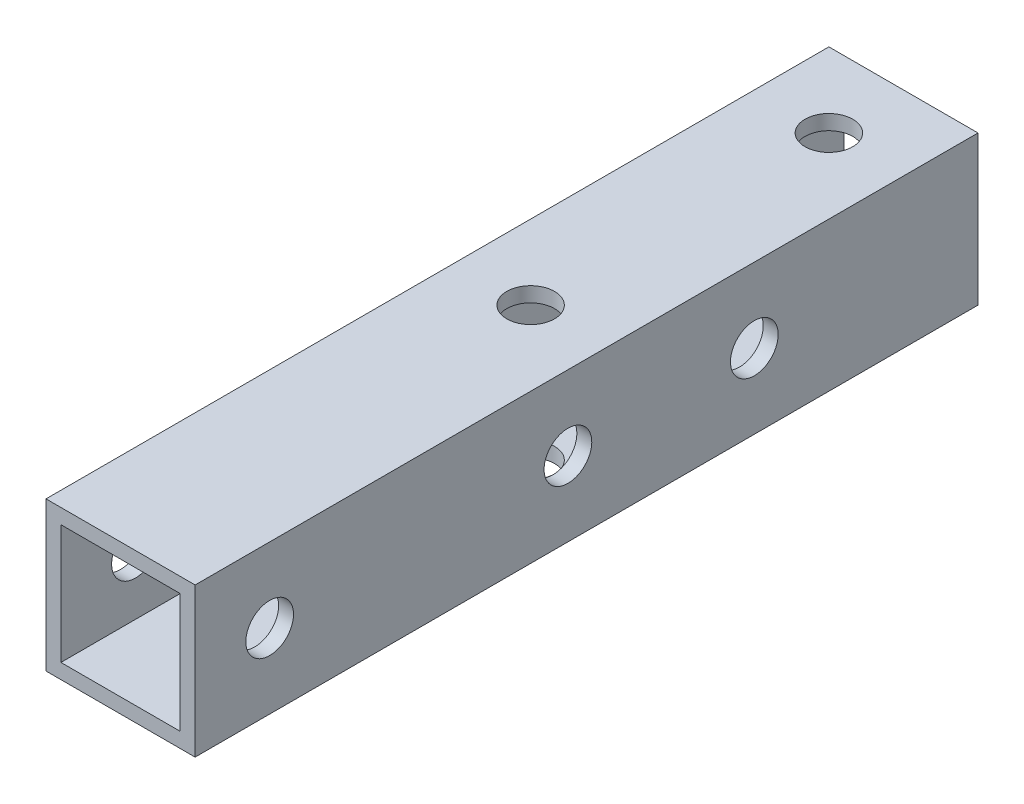
ISO-10303-21;
HEADER;
FILE_DESCRIPTION(('STEP AP214'),'2;1');
FILE_NAME('part.step','',(''),(''),'','','');
FILE_SCHEMA(('AUTOMOTIVE_DESIGN { 1 0 10303 214 1 1 1 1 }'));
ENDSEC;
DATA;
#1=APPLICATION_CONTEXT('core data for automotive mechanical design processes');
#2=APPLICATION_PROTOCOL_DEFINITION('international standard','automotive_design',2000,#1);
#3=PRODUCT_CONTEXT('',#1,'mechanical');
#4=PRODUCT('Part','Part','',(#3));
#5=PRODUCT_RELATED_PRODUCT_CATEGORY('part','',(#4));
#6=PRODUCT_DEFINITION_FORMATION('','',#4);
#7=PRODUCT_DEFINITION_CONTEXT('part definition',#1,'design');
#8=PRODUCT_DEFINITION('design','',#6,#7);
#9=PRODUCT_DEFINITION_SHAPE('','',#8);
#10=(LENGTH_UNIT() NAMED_UNIT(*) SI_UNIT(.MILLI.,.METRE.));
#11=(NAMED_UNIT(*) PLANE_ANGLE_UNIT() SI_UNIT($,.RADIAN.));
#12=(NAMED_UNIT(*) SI_UNIT($,.STERADIAN.) SOLID_ANGLE_UNIT());
#13=UNCERTAINTY_MEASURE_WITH_UNIT(LENGTH_MEASURE(1.E-05),#10,'distance_accuracy_value','');
#14=(GEOMETRIC_REPRESENTATION_CONTEXT(3) GLOBAL_UNCERTAINTY_ASSIGNED_CONTEXT((#13)) GLOBAL_UNIT_ASSIGNED_CONTEXT((#10,
#11,#12)) REPRESENTATION_CONTEXT('',''));
#15=CARTESIAN_POINT('',(0.,0.,0.));
#16=DIRECTION('',(0.,0.,1.));
#17=DIRECTION('',(1.,0.,0.));
#18=AXIS2_PLACEMENT_3D('',#15,#16,#17);
#19=CARTESIAN_POINT('',(0.,0.,52.5));
#20=DIRECTION('',(0.,0.,1.));
#21=DIRECTION('',(1.,0.,0.));
#22=AXIS2_PLACEMENT_3D('',#19,#20,#21);
#23=PLANE('',#22);
#24=DIRECTION('',(0.,-1.,0.));
#25=VECTOR('',#24,1.);
#26=CARTESIAN_POINT('',(-5.,5.,52.5));
#27=LINE('',#26,#25);
#28=CARTESIAN_POINT('',(-5.,5.,52.5));
#29=VERTEX_POINT('',#28);
#30=CARTESIAN_POINT('',(-5.,-5.,52.5));
#31=VERTEX_POINT('',#30);
#32=EDGE_CURVE('E181',#29,#31,#27,.T.);
#33=ORIENTED_EDGE('',*,*,#32,.T.);
#34=DIRECTION('',(1.,0.,0.));
#35=VECTOR('',#34,1.);
#36=CARTESIAN_POINT('',(5.,-5.,52.5));
#37=LINE('',#36,#35);
#38=CARTESIAN_POINT('',(5.,-5.,52.5));
#39=VERTEX_POINT('',#38);
#40=EDGE_CURVE('E185',#31,#39,#37,.T.);
#41=ORIENTED_EDGE('',*,*,#40,.T.);
#42=DIRECTION('',(0.,1.,0.));
#43=VECTOR('',#42,1.);
#44=CARTESIAN_POINT('',(5.,5.,52.5));
#45=LINE('',#44,#43);
#46=CARTESIAN_POINT('',(5.,5.,52.5));
#47=VERTEX_POINT('',#46);
#48=EDGE_CURVE('E189',#39,#47,#45,.T.);
#49=ORIENTED_EDGE('',*,*,#48,.T.);
#50=DIRECTION('',(-1.,0.,0.));
#51=VECTOR('',#50,1.);
#52=CARTESIAN_POINT('',(5.,5.,52.5));
#53=LINE('',#52,#51);
#54=EDGE_CURVE('E192',#47,#29,#53,.T.);
#55=ORIENTED_EDGE('',*,*,#54,.T.);
#56=EDGE_LOOP('',(#33,#41,#49,#55));
#57=FACE_BOUND('',#56,.T.);
#58=DIRECTION('',(1.,0.,0.));
#59=VECTOR('',#58,1.);
#60=CARTESIAN_POINT('',(0.,-4.,52.5));
#61=LINE('',#60,#59);
#62=CARTESIAN_POINT('',(-4.,-4.,52.5));
#63=VERTEX_POINT('',#62);
#64=CARTESIAN_POINT('',(4.,-4.,52.5));
#65=VERTEX_POINT('',#64);
#66=EDGE_CURVE('E140',#63,#65,#61,.T.);
#67=ORIENTED_EDGE('',*,*,#66,.F.);
#68=DIRECTION('',(0.,-1.,0.));
#69=VECTOR('',#68,1.);
#70=CARTESIAN_POINT('',(-4.,0.,52.5));
#71=LINE('',#70,#69);
#72=CARTESIAN_POINT('',(-4.,4.,52.5));
#73=VERTEX_POINT('',#72);
#74=EDGE_CURVE('E131',#73,#63,#71,.T.);
#75=ORIENTED_EDGE('',*,*,#74,.F.);
#76=DIRECTION('',(-1.,0.,0.));
#77=VECTOR('',#76,1.);
#78=CARTESIAN_POINT('',(0.,4.,52.5));
#79=LINE('',#78,#77);
#80=CARTESIAN_POINT('',(4.,4.,52.5));
#81=VERTEX_POINT('',#80);
#82=EDGE_CURVE('E157',#81,#73,#79,.T.);
#83=ORIENTED_EDGE('',*,*,#82,.F.);
#84=DIRECTION('',(0.,1.,0.));
#85=VECTOR('',#84,1.);
#86=CARTESIAN_POINT('',(4.,0.,52.5));
#87=LINE('',#86,#85);
#88=EDGE_CURVE('E153',#65,#81,#87,.T.);
#89=ORIENTED_EDGE('',*,*,#88,.F.);
#90=EDGE_LOOP('',(#67,#75,#83,#89));
#91=FACE_BOUND('',#90,.T.);
#92=ADVANCED_FACE('F63',(#57,#91),#23,.T.);
#93=CARTESIAN_POINT('',(0.,0.,0.));
#94=DIRECTION('',(0.,0.,1.));
#95=DIRECTION('',(1.,0.,0.));
#96=AXIS2_PLACEMENT_3D('',#93,#94,#95);
#97=PLANE('',#96);
#98=DIRECTION('',(0.,-1.,0.));
#99=VECTOR('',#98,1.);
#100=CARTESIAN_POINT('',(-5.,5.,0.));
#101=LINE('',#100,#99);
#102=CARTESIAN_POINT('',(-5.,5.,0.));
#103=VERTEX_POINT('',#102);
#104=CARTESIAN_POINT('',(-5.,-5.,0.));
#105=VERTEX_POINT('',#104);
#106=EDGE_CURVE('E149',#103,#105,#101,.T.);
#107=ORIENTED_EDGE('',*,*,#106,.F.);
#108=DIRECTION('',(-1.,0.,0.));
#109=VECTOR('',#108,1.);
#110=CARTESIAN_POINT('',(5.,5.,0.));
#111=LINE('',#110,#109);
#112=CARTESIAN_POINT('',(5.,5.,0.));
#113=VERTEX_POINT('',#112);
#114=EDGE_CURVE('E186',#113,#103,#111,.T.);
#115=ORIENTED_EDGE('',*,*,#114,.F.);
#116=DIRECTION('',(0.,1.,0.));
#117=VECTOR('',#116,1.);
#118=CARTESIAN_POINT('',(5.,5.,0.));
#119=LINE('',#118,#117);
#120=CARTESIAN_POINT('',(5.,-5.,0.));
#121=VERTEX_POINT('',#120);
#122=EDGE_CURVE('E202',#121,#113,#119,.T.);
#123=ORIENTED_EDGE('',*,*,#122,.F.);
#124=DIRECTION('',(1.,0.,0.));
#125=VECTOR('',#124,1.);
#126=CARTESIAN_POINT('',(5.,-5.,0.));
#127=LINE('',#126,#125);
#128=EDGE_CURVE('E199',#105,#121,#127,.T.);
#129=ORIENTED_EDGE('',*,*,#128,.F.);
#130=EDGE_LOOP('',(#107,#115,#123,#129));
#131=FACE_BOUND('',#130,.T.);
#132=DIRECTION('',(0.,-1.,0.));
#133=VECTOR('',#132,1.);
#134=CARTESIAN_POINT('',(-4.,0.,0.));
#135=LINE('',#134,#133);
#136=CARTESIAN_POINT('',(-4.,4.,0.));
#137=VERTEX_POINT('',#136);
#138=CARTESIAN_POINT('',(-4.,-4.,0.));
#139=VERTEX_POINT('',#138);
#140=EDGE_CURVE('E89',#137,#139,#135,.T.);
#141=ORIENTED_EDGE('',*,*,#140,.T.);
#142=DIRECTION('',(1.,0.,0.));
#143=VECTOR('',#142,1.);
#144=CARTESIAN_POINT('',(0.,-4.,0.));
#145=LINE('',#144,#143);
#146=CARTESIAN_POINT('',(4.,-4.,0.));
#147=VERTEX_POINT('',#146);
#148=EDGE_CURVE('E147',#139,#147,#145,.T.);
#149=ORIENTED_EDGE('',*,*,#148,.T.);
#150=DIRECTION('',(0.,1.,0.));
#151=VECTOR('',#150,1.);
#152=CARTESIAN_POINT('',(4.,0.,0.));
#153=LINE('',#152,#151);
#154=CARTESIAN_POINT('',(4.,4.,0.));
#155=VERTEX_POINT('',#154);
#156=EDGE_CURVE('E168',#147,#155,#153,.T.);
#157=ORIENTED_EDGE('',*,*,#156,.T.);
#158=DIRECTION('',(-1.,0.,0.));
#159=VECTOR('',#158,1.);
#160=CARTESIAN_POINT('',(0.,4.,0.));
#161=LINE('',#160,#159);
#162=EDGE_CURVE('E141',#155,#137,#161,.T.);
#163=ORIENTED_EDGE('',*,*,#162,.T.);
#164=EDGE_LOOP('',(#141,#149,#157,#163));
#165=FACE_BOUND('',#164,.T.);
#166=ADVANCED_FACE('F302',(#131,#165),#97,.F.);
#167=CARTESIAN_POINT('',(-5.,5.,52.5));
#168=DIRECTION('',(1.,0.,0.));
#169=DIRECTION('',(0.,1.,0.));
#170=AXIS2_PLACEMENT_3D('',#167,#168,#169);
#171=PLANE('',#170);
#172=CARTESIAN_POINT('',(-5.,0.,15.));
#173=DIRECTION('',(-1.,0.,0.));
#174=DIRECTION('',(0.,-1.,0.));
#175=AXIS2_PLACEMENT_3D('',#172,#173,#174);
#176=CIRCLE('',#175,1.6);
#177=CARTESIAN_POINT('',(-5.,-1.6,15.));
#178=VERTEX_POINT('',#177);
#179=EDGE_CURVE('E351',#178,#178,#176,.T.);
#180=ORIENTED_EDGE('',*,*,#179,.F.);
#181=EDGE_LOOP('',(#180));
#182=FACE_BOUND('',#181,.T.);
#183=CARTESIAN_POINT('',(-5.,0.,47.5));
#184=DIRECTION('',(1.,0.,0.));
#185=DIRECTION('',(0.,1.,0.));
#186=AXIS2_PLACEMENT_3D('',#183,#184,#185);
#187=CIRCLE('',#186,1.6);
#188=CARTESIAN_POINT('',(-5.,1.6,47.5));
#189=VERTEX_POINT('',#188);
#190=EDGE_CURVE('E231',#189,#189,#187,.T.);
#191=ORIENTED_EDGE('',*,*,#190,.T.);
#192=EDGE_LOOP('',(#191));
#193=FACE_BOUND('',#192,.T.);
#194=CARTESIAN_POINT('',(-5.,0.,27.5));
#195=DIRECTION('',(1.,0.,0.));
#196=DIRECTION('',(0.,1.,0.));
#197=AXIS2_PLACEMENT_3D('',#194,#195,#196);
#198=CIRCLE('',#197,1.6);
#199=CARTESIAN_POINT('',(-5.,1.6,27.5));
#200=VERTEX_POINT('',#199);
#201=EDGE_CURVE('E338',#200,#200,#198,.T.);
#202=ORIENTED_EDGE('',*,*,#201,.T.);
#203=EDGE_LOOP('',(#202));
#204=FACE_BOUND('',#203,.T.);
#205=ORIENTED_EDGE('',*,*,#106,.T.);
#206=DIRECTION('',(0.,0.,-1.));
#207=VECTOR('',#206,1.);
#208=CARTESIAN_POINT('',(-5.,-5.,52.5));
#209=LINE('',#208,#207);
#210=EDGE_CURVE('E12',#31,#105,#209,.T.);
#211=ORIENTED_EDGE('',*,*,#210,.F.);
#212=ORIENTED_EDGE('',*,*,#32,.F.);
#213=DIRECTION('',(0.,0.,-1.));
#214=VECTOR('',#213,1.);
#215=CARTESIAN_POINT('',(-5.,5.,52.5));
#216=LINE('',#215,#214);
#217=EDGE_CURVE('E195',#29,#103,#216,.T.);
#218=ORIENTED_EDGE('',*,*,#217,.T.);
#219=EDGE_LOOP('',(#205,#211,#212,#218));
#220=FACE_BOUND('',#219,.T.);
#221=ADVANCED_FACE('F65',(#182,#193,#204,#220),#171,.F.);
#222=CARTESIAN_POINT('',(5.,-5.,52.5));
#223=DIRECTION('',(0.,1.,0.));
#224=DIRECTION('',(-1.,0.,0.));
#225=AXIS2_PLACEMENT_3D('',#222,#223,#224);
#226=PLANE('',#225);
#227=CARTESIAN_POINT('',(0.,-5.,5.));
#228=DIRECTION('',(0.,1.,0.));
#229=DIRECTION('',(-1.,0.,0.));
#230=AXIS2_PLACEMENT_3D('',#227,#228,#229);
#231=CIRCLE('',#230,1.6);
#232=CARTESIAN_POINT('',(-1.6,-5.,5.));
#233=VERTEX_POINT('',#232);
#234=EDGE_CURVE('E222',#233,#233,#231,.T.);
#235=ORIENTED_EDGE('',*,*,#234,.T.);
#236=EDGE_LOOP('',(#235));
#237=FACE_BOUND('',#236,.T.);
#238=CARTESIAN_POINT('',(0.,-5.,25.));
#239=DIRECTION('',(0.,1.,0.));
#240=DIRECTION('',(-1.,0.,0.));
#241=AXIS2_PLACEMENT_3D('',#238,#239,#240);
#242=CIRCLE('',#241,1.6);
#243=CARTESIAN_POINT('',(-1.6,-5.,25.));
#244=VERTEX_POINT('',#243);
#245=EDGE_CURVE('E258',#244,#244,#242,.T.);
#246=ORIENTED_EDGE('',*,*,#245,.T.);
#247=EDGE_LOOP('',(#246));
#248=FACE_BOUND('',#247,.T.);
#249=ORIENTED_EDGE('',*,*,#128,.T.);
#250=DIRECTION('',(0.,0.,-1.));
#251=VECTOR('',#250,1.);
#252=CARTESIAN_POINT('',(5.,-5.,52.5));
#253=LINE('',#252,#251);
#254=EDGE_CURVE('E73',#39,#121,#253,.T.);
#255=ORIENTED_EDGE('',*,*,#254,.F.);
#256=ORIENTED_EDGE('',*,*,#40,.F.);
#257=ORIENTED_EDGE('',*,*,#210,.T.);
#258=EDGE_LOOP('',(#249,#255,#256,#257));
#259=FACE_BOUND('',#258,.T.);
#260=ADVANCED_FACE('F288',(#237,#248,#259),#226,.F.);
#261=CARTESIAN_POINT('',(5.,5.,52.5));
#262=DIRECTION('',(-1.,0.,0.));
#263=DIRECTION('',(0.,-1.,0.));
#264=AXIS2_PLACEMENT_3D('',#261,#262,#263);
#265=PLANE('',#264);
#266=CARTESIAN_POINT('',(5.,0.,15.));
#267=DIRECTION('',(-1.,0.,0.));
#268=DIRECTION('',(0.,-1.,0.));
#269=AXIS2_PLACEMENT_3D('',#266,#267,#268);
#270=CIRCLE('',#269,1.6);
#271=CARTESIAN_POINT('',(5.,-1.6,15.));
#272=VERTEX_POINT('',#271);
#273=EDGE_CURVE('E329',#272,#272,#270,.T.);
#274=ORIENTED_EDGE('',*,*,#273,.T.);
#275=EDGE_LOOP('',(#274));
#276=FACE_BOUND('',#275,.T.);
#277=CARTESIAN_POINT('',(5.,0.,47.5));
#278=DIRECTION('',(1.,0.,0.));
#279=DIRECTION('',(0.,1.,0.));
#280=AXIS2_PLACEMENT_3D('',#277,#278,#279);
#281=CIRCLE('',#280,1.6);
#282=CARTESIAN_POINT('',(5.,1.6,47.5));
#283=VERTEX_POINT('',#282);
#284=EDGE_CURVE('E333',#283,#283,#281,.T.);
#285=ORIENTED_EDGE('',*,*,#284,.F.);
#286=EDGE_LOOP('',(#285));
#287=FACE_BOUND('',#286,.T.);
#288=CARTESIAN_POINT('',(5.,0.,27.5));
#289=DIRECTION('',(1.,0.,0.));
#290=DIRECTION('',(0.,1.,0.));
#291=AXIS2_PLACEMENT_3D('',#288,#289,#290);
#292=CIRCLE('',#291,1.6);
#293=CARTESIAN_POINT('',(5.,1.6,27.5));
#294=VERTEX_POINT('',#293);
#295=EDGE_CURVE('E248',#294,#294,#292,.T.);
#296=ORIENTED_EDGE('',*,*,#295,.F.);
#297=EDGE_LOOP('',(#296));
#298=FACE_BOUND('',#297,.T.);
#299=ORIENTED_EDGE('',*,*,#122,.T.);
#300=DIRECTION('',(0.,0.,-1.));
#301=VECTOR('',#300,1.);
#302=CARTESIAN_POINT('',(5.,5.,52.5));
#303=LINE('',#302,#301);
#304=EDGE_CURVE('E210',#47,#113,#303,.T.);
#305=ORIENTED_EDGE('',*,*,#304,.F.);
#306=ORIENTED_EDGE('',*,*,#48,.F.);
#307=ORIENTED_EDGE('',*,*,#254,.T.);
#308=EDGE_LOOP('',(#299,#305,#306,#307));
#309=FACE_BOUND('',#308,.T.);
#310=ADVANCED_FACE('F291',(#276,#287,#298,#309),#265,.F.);
#311=CARTESIAN_POINT('',(5.,5.,52.5));
#312=DIRECTION('',(0.,-1.,0.));
#313=DIRECTION('',(1.,0.,0.));
#314=AXIS2_PLACEMENT_3D('',#311,#312,#313);
#315=PLANE('',#314);
#316=CARTESIAN_POINT('',(0.,5.,5.));
#317=DIRECTION('',(0.,1.,0.));
#318=DIRECTION('',(-1.,0.,0.));
#319=AXIS2_PLACEMENT_3D('',#316,#317,#318);
#320=CIRCLE('',#319,1.6);
#321=CARTESIAN_POINT('',(-1.6,5.,5.));
#322=VERTEX_POINT('',#321);
#323=EDGE_CURVE('E254',#322,#322,#320,.T.);
#324=ORIENTED_EDGE('',*,*,#323,.F.);
#325=EDGE_LOOP('',(#324));
#326=FACE_BOUND('',#325,.T.);
#327=CARTESIAN_POINT('',(0.,5.,25.));
#328=DIRECTION('',(0.,1.,0.));
#329=DIRECTION('',(-1.,0.,0.));
#330=AXIS2_PLACEMENT_3D('',#327,#328,#329);
#331=CIRCLE('',#330,1.6);
#332=CARTESIAN_POINT('',(-1.6,5.,25.));
#333=VERTEX_POINT('',#332);
#334=EDGE_CURVE('E241',#333,#333,#331,.T.);
#335=ORIENTED_EDGE('',*,*,#334,.F.);
#336=EDGE_LOOP('',(#335));
#337=FACE_BOUND('',#336,.T.);
#338=ORIENTED_EDGE('',*,*,#114,.T.);
#339=ORIENTED_EDGE('',*,*,#217,.F.);
#340=ORIENTED_EDGE('',*,*,#54,.F.);
#341=ORIENTED_EDGE('',*,*,#304,.T.);
#342=EDGE_LOOP('',(#338,#339,#340,#341));
#343=FACE_BOUND('',#342,.T.);
#344=ADVANCED_FACE('F306',(#326,#337,#343),#315,.F.);
#345=CARTESIAN_POINT('',(-4.,0.,52.5));
#346=DIRECTION('',(1.,0.,0.));
#347=DIRECTION('',(0.,1.,0.));
#348=AXIS2_PLACEMENT_3D('',#345,#346,#347);
#349=PLANE('',#348);
#350=CARTESIAN_POINT('',(-4.,0.,15.));
#351=DIRECTION('',(1.,0.,0.));
#352=DIRECTION('',(0.,1.,0.));
#353=AXIS2_PLACEMENT_3D('',#350,#351,#352);
#354=CIRCLE('',#353,1.6);
#355=CARTESIAN_POINT('',(-4.,1.6,15.));
#356=VERTEX_POINT('',#355);
#357=EDGE_CURVE('E339',#356,#356,#354,.T.);
#358=ORIENTED_EDGE('',*,*,#357,.F.);
#359=EDGE_LOOP('',(#358));
#360=FACE_BOUND('',#359,.T.);
#361=CARTESIAN_POINT('',(-4.,0.,47.5));
#362=DIRECTION('',(1.,0.,0.));
#363=DIRECTION('',(0.,1.,0.));
#364=AXIS2_PLACEMENT_3D('',#361,#362,#363);
#365=CIRCLE('',#364,1.6);
#366=CARTESIAN_POINT('',(-4.,1.6,47.5));
#367=VERTEX_POINT('',#366);
#368=EDGE_CURVE('E235',#367,#367,#365,.T.);
#369=ORIENTED_EDGE('',*,*,#368,.F.);
#370=EDGE_LOOP('',(#369));
#371=FACE_BOUND('',#370,.T.);
#372=CARTESIAN_POINT('',(-4.,0.,27.5));
#373=DIRECTION('',(1.,0.,0.));
#374=DIRECTION('',(0.,1.,0.));
#375=AXIS2_PLACEMENT_3D('',#372,#373,#374);
#376=CIRCLE('',#375,1.6);
#377=CARTESIAN_POINT('',(-4.,1.6,27.5));
#378=VERTEX_POINT('',#377);
#379=EDGE_CURVE('E230',#378,#378,#376,.T.);
#380=ORIENTED_EDGE('',*,*,#379,.F.);
#381=EDGE_LOOP('',(#380));
#382=FACE_BOUND('',#381,.T.);
#383=ORIENTED_EDGE('',*,*,#140,.F.);
#384=DIRECTION('',(0.,0.,-1.));
#385=VECTOR('',#384,1.);
#386=CARTESIAN_POINT('',(-4.,4.,52.5));
#387=LINE('',#386,#385);
#388=EDGE_CURVE('E135',#73,#137,#387,.T.);
#389=ORIENTED_EDGE('',*,*,#388,.F.);
#390=ORIENTED_EDGE('',*,*,#74,.T.);
#391=DIRECTION('',(0.,0.,-1.));
#392=VECTOR('',#391,1.);
#393=CARTESIAN_POINT('',(-4.,-4.,52.5));
#394=LINE('',#393,#392);
#395=EDGE_CURVE('E134',#63,#139,#394,.T.);
#396=ORIENTED_EDGE('',*,*,#395,.T.);
#397=EDGE_LOOP('',(#383,#389,#390,#396));
#398=FACE_BOUND('',#397,.T.);
#399=ADVANCED_FACE('F133',(#360,#371,#382,#398),#349,.T.);
#400=CARTESIAN_POINT('',(0.,-4.,52.5));
#401=DIRECTION('',(0.,1.,0.));
#402=DIRECTION('',(-1.,0.,0.));
#403=AXIS2_PLACEMENT_3D('',#400,#401,#402);
#404=PLANE('',#403);
#405=CARTESIAN_POINT('',(0.,-4.,5.));
#406=DIRECTION('',(0.,1.,0.));
#407=DIRECTION('',(-1.,0.,0.));
#408=AXIS2_PLACEMENT_3D('',#405,#406,#407);
#409=CIRCLE('',#408,1.6);
#410=CARTESIAN_POINT('',(-1.6,-4.,5.));
#411=VERTEX_POINT('',#410);
#412=EDGE_CURVE('E165',#411,#411,#409,.T.);
#413=ORIENTED_EDGE('',*,*,#412,.F.);
#414=EDGE_LOOP('',(#413));
#415=FACE_BOUND('',#414,.T.);
#416=CARTESIAN_POINT('',(0.,-4.,25.));
#417=DIRECTION('',(0.,1.,0.));
#418=DIRECTION('',(-1.,0.,0.));
#419=AXIS2_PLACEMENT_3D('',#416,#417,#418);
#420=CIRCLE('',#419,1.6);
#421=CARTESIAN_POINT('',(-1.6,-4.,25.));
#422=VERTEX_POINT('',#421);
#423=EDGE_CURVE('E221',#422,#422,#420,.T.);
#424=ORIENTED_EDGE('',*,*,#423,.F.);
#425=EDGE_LOOP('',(#424));
#426=FACE_BOUND('',#425,.T.);
#427=ORIENTED_EDGE('',*,*,#148,.F.);
#428=ORIENTED_EDGE('',*,*,#395,.F.);
#429=ORIENTED_EDGE('',*,*,#66,.T.);
#430=DIRECTION('',(0.,0.,-1.));
#431=VECTOR('',#430,1.);
#432=CARTESIAN_POINT('',(4.,-4.,52.5));
#433=LINE('',#432,#431);
#434=EDGE_CURVE('E150',#65,#147,#433,.T.);
#435=ORIENTED_EDGE('',*,*,#434,.T.);
#436=EDGE_LOOP('',(#427,#428,#429,#435));
#437=FACE_BOUND('',#436,.T.);
#438=ADVANCED_FACE('F144',(#415,#426,#437),#404,.T.);
#439=CARTESIAN_POINT('',(4.,0.,52.5));
#440=DIRECTION('',(-1.,0.,0.));
#441=DIRECTION('',(0.,-1.,0.));
#442=AXIS2_PLACEMENT_3D('',#439,#440,#441);
#443=PLANE('',#442);
#444=CARTESIAN_POINT('',(4.,0.,15.));
#445=DIRECTION('',(-1.,0.,0.));
#446=DIRECTION('',(0.,-1.,0.));
#447=AXIS2_PLACEMENT_3D('',#444,#445,#446);
#448=CIRCLE('',#447,1.6);
#449=CARTESIAN_POINT('',(4.,-1.6,15.));
#450=VERTEX_POINT('',#449);
#451=EDGE_CURVE('E67',#450,#450,#448,.T.);
#452=ORIENTED_EDGE('',*,*,#451,.F.);
#453=EDGE_LOOP('',(#452));
#454=FACE_BOUND('',#453,.T.);
#455=CARTESIAN_POINT('',(4.,0.,47.5));
#456=DIRECTION('',(-1.,0.,0.));
#457=DIRECTION('',(0.,-1.,0.));
#458=AXIS2_PLACEMENT_3D('',#455,#456,#457);
#459=CIRCLE('',#458,1.6);
#460=CARTESIAN_POINT('',(4.,-1.6,47.5));
#461=VERTEX_POINT('',#460);
#462=EDGE_CURVE('E232',#461,#461,#459,.T.);
#463=ORIENTED_EDGE('',*,*,#462,.F.);
#464=EDGE_LOOP('',(#463));
#465=FACE_BOUND('',#464,.T.);
#466=CARTESIAN_POINT('',(4.,0.,27.5));
#467=DIRECTION('',(-1.,0.,0.));
#468=DIRECTION('',(0.,-1.,0.));
#469=AXIS2_PLACEMENT_3D('',#466,#467,#468);
#470=CIRCLE('',#469,1.6);
#471=CARTESIAN_POINT('',(4.,-1.6,27.5));
#472=VERTEX_POINT('',#471);
#473=EDGE_CURVE('E227',#472,#472,#470,.T.);
#474=ORIENTED_EDGE('',*,*,#473,.F.);
#475=EDGE_LOOP('',(#474));
#476=FACE_BOUND('',#475,.T.);
#477=ORIENTED_EDGE('',*,*,#156,.F.);
#478=ORIENTED_EDGE('',*,*,#434,.F.);
#479=ORIENTED_EDGE('',*,*,#88,.T.);
#480=DIRECTION('',(0.,0.,-1.));
#481=VECTOR('',#480,1.);
#482=CARTESIAN_POINT('',(4.,4.,52.5));
#483=LINE('',#482,#481);
#484=EDGE_CURVE('E81',#81,#155,#483,.T.);
#485=ORIENTED_EDGE('',*,*,#484,.T.);
#486=EDGE_LOOP('',(#477,#478,#479,#485));
#487=FACE_BOUND('',#486,.T.);
#488=ADVANCED_FACE('F276',(#454,#465,#476,#487),#443,.T.);
#489=CARTESIAN_POINT('',(0.,4.,52.5));
#490=DIRECTION('',(0.,-1.,0.));
#491=DIRECTION('',(1.,0.,0.));
#492=AXIS2_PLACEMENT_3D('',#489,#490,#491);
#493=PLANE('',#492);
#494=CARTESIAN_POINT('',(0.,4.,5.));
#495=DIRECTION('',(0.,-1.,0.));
#496=DIRECTION('',(1.,0.,0.));
#497=AXIS2_PLACEMENT_3D('',#494,#495,#496);
#498=CIRCLE('',#497,1.6);
#499=CARTESIAN_POINT('',(1.6,4.,5.));
#500=VERTEX_POINT('',#499);
#501=EDGE_CURVE('E223',#500,#500,#498,.T.);
#502=ORIENTED_EDGE('',*,*,#501,.F.);
#503=EDGE_LOOP('',(#502));
#504=FACE_BOUND('',#503,.T.);
#505=CARTESIAN_POINT('',(0.,4.,25.));
#506=DIRECTION('',(0.,-1.,0.));
#507=DIRECTION('',(1.,0.,0.));
#508=AXIS2_PLACEMENT_3D('',#505,#506,#507);
#509=CIRCLE('',#508,1.6);
#510=CARTESIAN_POINT('',(1.6,4.,25.));
#511=VERTEX_POINT('',#510);
#512=EDGE_CURVE('E217',#511,#511,#509,.T.);
#513=ORIENTED_EDGE('',*,*,#512,.F.);
#514=EDGE_LOOP('',(#513));
#515=FACE_BOUND('',#514,.T.);
#516=ORIENTED_EDGE('',*,*,#162,.F.);
#517=ORIENTED_EDGE('',*,*,#484,.F.);
#518=ORIENTED_EDGE('',*,*,#82,.T.);
#519=ORIENTED_EDGE('',*,*,#388,.T.);
#520=EDGE_LOOP('',(#516,#517,#518,#519));
#521=FACE_BOUND('',#520,.T.);
#522=ADVANCED_FACE('F412',(#504,#515,#521),#493,.T.);
#523=CARTESIAN_POINT('',(0.,-5.,25.));
#524=DIRECTION('',(0.,1.,0.));
#525=DIRECTION('',(-1.,0.,0.));
#526=AXIS2_PLACEMENT_3D('',#523,#524,#525);
#527=CYLINDRICAL_SURFACE('',#526,1.6);
#528=ORIENTED_EDGE('',*,*,#512,.T.);
#529=EDGE_LOOP('',(#528));
#530=FACE_BOUND('',#529,.T.);
#531=ORIENTED_EDGE('',*,*,#334,.T.);
#532=EDGE_LOOP('',(#531));
#533=FACE_BOUND('',#532,.T.);
#534=ADVANCED_FACE('F285',(#530,#533),#527,.F.);
#535=CARTESIAN_POINT('',(0.,-5.,5.));
#536=DIRECTION('',(0.,1.,0.));
#537=DIRECTION('',(-1.,0.,0.));
#538=AXIS2_PLACEMENT_3D('',#535,#536,#537);
#539=CYLINDRICAL_SURFACE('',#538,1.6);
#540=ORIENTED_EDGE('',*,*,#501,.T.);
#541=EDGE_LOOP('',(#540));
#542=FACE_BOUND('',#541,.T.);
#543=ORIENTED_EDGE('',*,*,#323,.T.);
#544=EDGE_LOOP('',(#543));
#545=FACE_BOUND('',#544,.T.);
#546=ADVANCED_FACE('F283',(#542,#545),#539,.F.);
#547=ORIENTED_EDGE('',*,*,#423,.T.);
#548=EDGE_LOOP('',(#547));
#549=FACE_BOUND('',#548,.T.);
#550=ORIENTED_EDGE('',*,*,#245,.F.);
#551=EDGE_LOOP('',(#550));
#552=FACE_BOUND('',#551,.T.);
#553=ADVANCED_FACE('F280',(#549,#552),#527,.F.);
#554=ORIENTED_EDGE('',*,*,#412,.T.);
#555=EDGE_LOOP('',(#554));
#556=FACE_BOUND('',#555,.T.);
#557=ORIENTED_EDGE('',*,*,#234,.F.);
#558=EDGE_LOOP('',(#557));
#559=FACE_BOUND('',#558,.T.);
#560=ADVANCED_FACE('F271',(#556,#559),#539,.F.);
#561=CARTESIAN_POINT('',(-5.,0.,27.5));
#562=DIRECTION('',(1.,0.,0.));
#563=DIRECTION('',(0.,1.,0.));
#564=AXIS2_PLACEMENT_3D('',#561,#562,#563);
#565=CYLINDRICAL_SURFACE('',#564,1.6);
#566=ORIENTED_EDGE('',*,*,#473,.T.);
#567=EDGE_LOOP('',(#566));
#568=FACE_BOUND('',#567,.T.);
#569=ORIENTED_EDGE('',*,*,#295,.T.);
#570=EDGE_LOOP('',(#569));
#571=FACE_BOUND('',#570,.T.);
#572=ADVANCED_FACE('F361',(#568,#571),#565,.F.);
#573=CARTESIAN_POINT('',(-5.,0.,47.5));
#574=DIRECTION('',(1.,0.,0.));
#575=DIRECTION('',(0.,1.,0.));
#576=AXIS2_PLACEMENT_3D('',#573,#574,#575);
#577=CYLINDRICAL_SURFACE('',#576,1.6);
#578=ORIENTED_EDGE('',*,*,#462,.T.);
#579=EDGE_LOOP('',(#578));
#580=FACE_BOUND('',#579,.T.);
#581=ORIENTED_EDGE('',*,*,#284,.T.);
#582=EDGE_LOOP('',(#581));
#583=FACE_BOUND('',#582,.T.);
#584=ADVANCED_FACE('F358',(#580,#583),#577,.F.);
#585=ORIENTED_EDGE('',*,*,#379,.T.);
#586=EDGE_LOOP('',(#585));
#587=FACE_BOUND('',#586,.T.);
#588=ORIENTED_EDGE('',*,*,#201,.F.);
#589=EDGE_LOOP('',(#588));
#590=FACE_BOUND('',#589,.T.);
#591=ADVANCED_FACE('F360',(#587,#590),#565,.F.);
#592=ORIENTED_EDGE('',*,*,#368,.T.);
#593=EDGE_LOOP('',(#592));
#594=FACE_BOUND('',#593,.T.);
#595=ORIENTED_EDGE('',*,*,#190,.F.);
#596=EDGE_LOOP('',(#595));
#597=FACE_BOUND('',#596,.T.);
#598=ADVANCED_FACE('F363',(#594,#597),#577,.F.);
#599=CARTESIAN_POINT('',(5.,0.,15.));
#600=DIRECTION('',(-1.,0.,0.));
#601=DIRECTION('',(0.,-1.,0.));
#602=AXIS2_PLACEMENT_3D('',#599,#600,#601);
#603=CYLINDRICAL_SURFACE('',#602,1.6);
#604=ORIENTED_EDGE('',*,*,#451,.T.);
#605=EDGE_LOOP('',(#604));
#606=FACE_BOUND('',#605,.T.);
#607=ORIENTED_EDGE('',*,*,#273,.F.);
#608=EDGE_LOOP('',(#607));
#609=FACE_BOUND('',#608,.T.);
#610=ADVANCED_FACE('F372',(#606,#609),#603,.F.);
#611=ORIENTED_EDGE('',*,*,#357,.T.);
#612=EDGE_LOOP('',(#611));
#613=FACE_BOUND('',#612,.T.);
#614=ORIENTED_EDGE('',*,*,#179,.T.);
#615=EDGE_LOOP('',(#614));
#616=FACE_BOUND('',#615,.T.);
#617=ADVANCED_FACE('F377',(#613,#616),#603,.F.);
#618=CLOSED_SHELL('',(#92,#166,#221,#260,#310,#344,#399,#438,#488,#522,#534,#546,#553,#560,#572,
#584,#591,#598,#610,#617));
#619=MANIFOLD_SOLID_BREP('B2',#618);
#620=ADVANCED_BREP_SHAPE_REPRESENTATION('',(#18,#619),#14);
#621=SHAPE_DEFINITION_REPRESENTATION(#9,#620);
ENDSEC;
END-ISO-10303-21;
